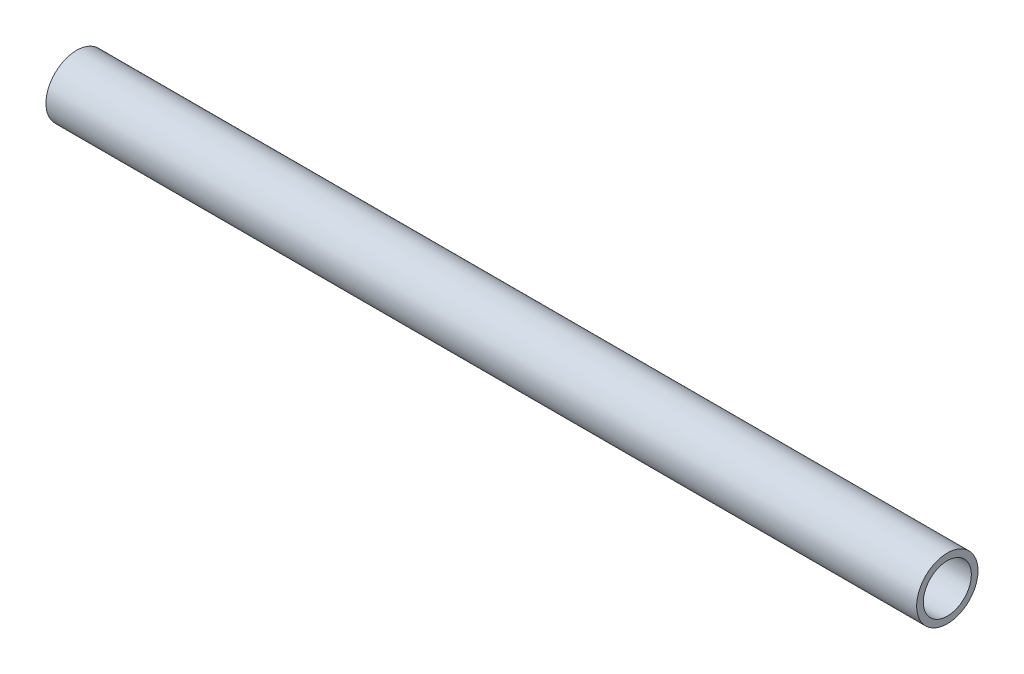
ISO-10303-21;
HEADER;
FILE_DESCRIPTION(('STEP AP214'),'2;1');
FILE_NAME('part.step','',(''),(''),'','','');
FILE_SCHEMA(('AUTOMOTIVE_DESIGN { 1 0 10303 214 1 1 1 1 }'));
ENDSEC;
DATA;
#1=APPLICATION_CONTEXT('core data for automotive mechanical design processes');
#2=APPLICATION_PROTOCOL_DEFINITION('international standard','automotive_design',2000,#1);
#3=PRODUCT_CONTEXT('',#1,'mechanical');
#4=PRODUCT('Part','Part','',(#3));
#5=PRODUCT_RELATED_PRODUCT_CATEGORY('part','',(#4));
#6=PRODUCT_DEFINITION_FORMATION('','',#4);
#7=PRODUCT_DEFINITION_CONTEXT('part definition',#1,'design');
#8=PRODUCT_DEFINITION('design','',#6,#7);
#9=PRODUCT_DEFINITION_SHAPE('','',#8);
#10=(LENGTH_UNIT() NAMED_UNIT(*) SI_UNIT(.MILLI.,.METRE.));
#11=(NAMED_UNIT(*) PLANE_ANGLE_UNIT() SI_UNIT($,.RADIAN.));
#12=(NAMED_UNIT(*) SI_UNIT($,.STERADIAN.) SOLID_ANGLE_UNIT());
#13=UNCERTAINTY_MEASURE_WITH_UNIT(LENGTH_MEASURE(1.E-05),#10,'distance_accuracy_value','');
#14=(GEOMETRIC_REPRESENTATION_CONTEXT(3) GLOBAL_UNCERTAINTY_ASSIGNED_CONTEXT((#13)) GLOBAL_UNIT_ASSIGNED_CONTEXT((#10,
#11,#12)) REPRESENTATION_CONTEXT('',''));
#15=CARTESIAN_POINT('',(0.,0.,0.));
#16=DIRECTION('',(0.,0.,1.));
#17=DIRECTION('',(1.,0.,0.));
#18=AXIS2_PLACEMENT_3D('',#15,#16,#17);
#19=CARTESIAN_POINT('',(378.9,0.,-2.66453525910038E-12));
#20=DIRECTION('',(1.,0.,0.));
#21=DIRECTION('',(0.,0.,-0.999999999999999));
#22=AXIS2_PLACEMENT_3D('',#19,#20,#21);
#23=PLANE('',#22);
#24=CARTESIAN_POINT('',(378.9,0.,-2.66453525910038E-12));
#25=DIRECTION('',(1.,0.,0.));
#26=DIRECTION('',(0.,0.,-0.999999999999999));
#27=AXIS2_PLACEMENT_3D('',#24,#25,#26);
#28=CIRCLE('',#27,13.35);
#29=CARTESIAN_POINT('',(378.9,0.,-13.3500000000027));
#30=VERTEX_POINT('',#29);
#31=EDGE_CURVE('E10',#30,#30,#28,.T.);
#32=ORIENTED_EDGE('',*,*,#31,.T.);
#33=EDGE_LOOP('',(#32));
#34=FACE_BOUND('',#33,.T.);
#35=CARTESIAN_POINT('',(378.9,0.,-2.66453525910038E-12));
#36=DIRECTION('',(1.,0.,0.));
#37=DIRECTION('',(0.,0.,-0.999999999999999));
#38=AXIS2_PLACEMENT_3D('',#35,#36,#37);
#39=CIRCLE('',#38,10.45);
#40=CARTESIAN_POINT('',(378.9,0.,-10.4500000000027));
#41=VERTEX_POINT('',#40);
#42=EDGE_CURVE('E41',#41,#41,#39,.T.);
#43=ORIENTED_EDGE('',*,*,#42,.F.);
#44=EDGE_LOOP('',(#43));
#45=FACE_BOUND('',#44,.T.);
#46=ADVANCED_FACE('F30',(#34,#45),#23,.T.);
#47=CARTESIAN_POINT('',(0.,0.,0.));
#48=DIRECTION('',(1.,0.,0.));
#49=DIRECTION('',(0.,0.,-0.999999999999999));
#50=AXIS2_PLACEMENT_3D('',#47,#48,#49);
#51=PLANE('',#50);
#52=CARTESIAN_POINT('',(0.,0.,0.));
#53=DIRECTION('',(1.,0.,0.));
#54=DIRECTION('',(0.,0.,-0.999999999999999));
#55=AXIS2_PLACEMENT_3D('',#52,#53,#54);
#56=CIRCLE('',#55,13.35);
#57=CARTESIAN_POINT('',(0.,0.,-13.35));
#58=VERTEX_POINT('',#57);
#59=EDGE_CURVE('E34',#58,#58,#56,.T.);
#60=ORIENTED_EDGE('',*,*,#59,.F.);
#61=EDGE_LOOP('',(#60));
#62=FACE_BOUND('',#61,.T.);
#63=CARTESIAN_POINT('',(0.,0.,0.));
#64=DIRECTION('',(1.,0.,0.));
#65=DIRECTION('',(0.,0.,-0.999999999999999));
#66=AXIS2_PLACEMENT_3D('',#63,#64,#65);
#67=CIRCLE('',#66,10.45);
#68=CARTESIAN_POINT('',(0.,0.,-10.45));
#69=VERTEX_POINT('',#68);
#70=EDGE_CURVE('E43',#69,#69,#67,.T.);
#71=ORIENTED_EDGE('',*,*,#70,.T.);
#72=EDGE_LOOP('',(#71));
#73=FACE_BOUND('',#72,.T.);
#74=ADVANCED_FACE('F53',(#62,#73),#51,.F.);
#75=CARTESIAN_POINT('',(378.9,0.,-2.66453525910038E-12));
#76=DIRECTION('',(-1.,0.,0.));
#77=DIRECTION('',(0.,0.,0.999999999999999));
#78=AXIS2_PLACEMENT_3D('',#75,#76,#77);
#79=CYLINDRICAL_SURFACE('',#78,13.35);
#80=ORIENTED_EDGE('',*,*,#31,.F.);
#81=EDGE_LOOP('',(#80));
#82=FACE_BOUND('',#81,.T.);
#83=ORIENTED_EDGE('',*,*,#59,.T.);
#84=EDGE_LOOP('',(#83));
#85=FACE_BOUND('',#84,.T.);
#86=ADVANCED_FACE('F32',(#82,#85),#79,.T.);
#87=CARTESIAN_POINT('',(378.9,0.,-2.66453525910038E-12));
#88=DIRECTION('',(-1.,0.,0.));
#89=DIRECTION('',(0.,0.,0.999999999999999));
#90=AXIS2_PLACEMENT_3D('',#87,#88,#89);
#91=CYLINDRICAL_SURFACE('',#90,10.45);
#92=ORIENTED_EDGE('',*,*,#42,.T.);
#93=EDGE_LOOP('',(#92));
#94=FACE_BOUND('',#93,.T.);
#95=ORIENTED_EDGE('',*,*,#70,.F.);
#96=EDGE_LOOP('',(#95));
#97=FACE_BOUND('',#96,.T.);
#98=ADVANCED_FACE('F49',(#94,#97),#91,.F.);
#99=CLOSED_SHELL('',(#46,#74,#86,#98));
#100=MANIFOLD_SOLID_BREP('B2',#99);
#101=ADVANCED_BREP_SHAPE_REPRESENTATION('',(#18,#100),#14);
#102=SHAPE_DEFINITION_REPRESENTATION(#9,#101);
ENDSEC;
END-ISO-10303-21;
